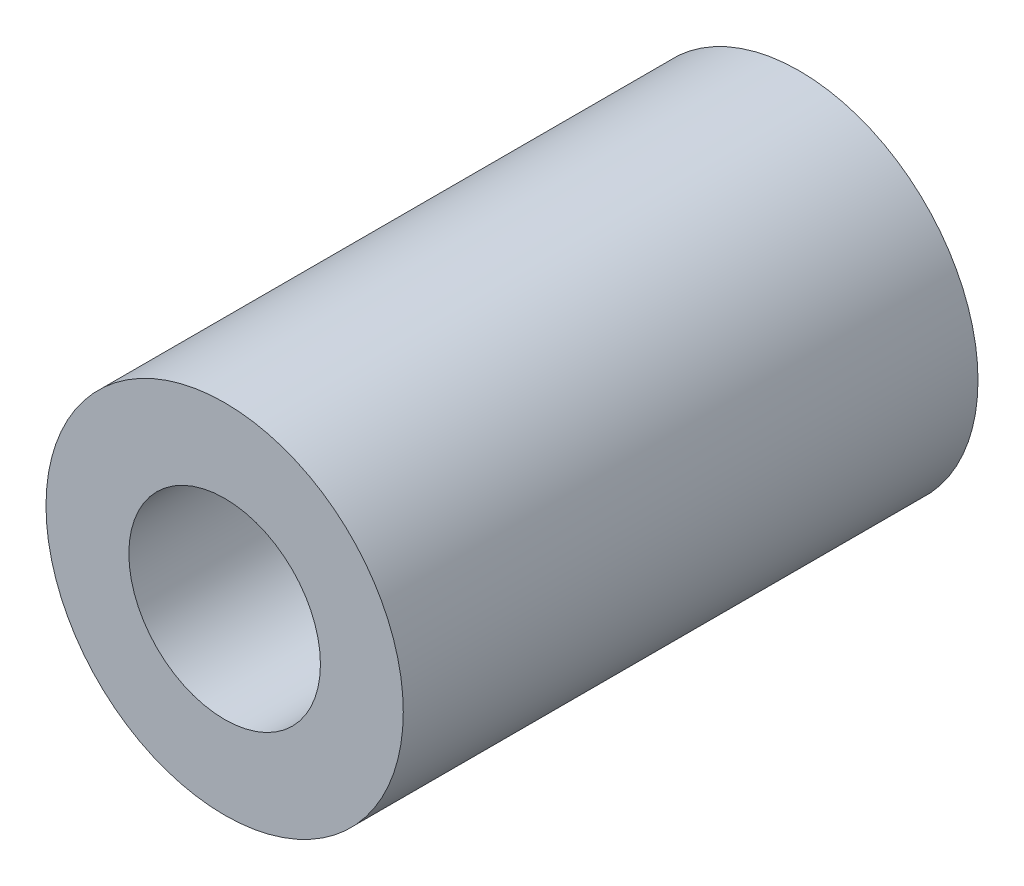
ISO-10303-21;
HEADER;
FILE_DESCRIPTION(('STEP AP214'),'2;1');
FILE_NAME('part.step','',(''),(''),'','','');
FILE_SCHEMA(('AUTOMOTIVE_DESIGN { 1 0 10303 214 1 1 1 1 }'));
ENDSEC;
DATA;
#1=APPLICATION_CONTEXT('core data for automotive mechanical design processes');
#2=APPLICATION_PROTOCOL_DEFINITION('international standard','automotive_design',2000,#1);
#3=PRODUCT_CONTEXT('',#1,'mechanical');
#4=PRODUCT('Part','Part','',(#3));
#5=PRODUCT_RELATED_PRODUCT_CATEGORY('part','',(#4));
#6=PRODUCT_DEFINITION_FORMATION('','',#4);
#7=PRODUCT_DEFINITION_CONTEXT('part definition',#1,'design');
#8=PRODUCT_DEFINITION('design','',#6,#7);
#9=PRODUCT_DEFINITION_SHAPE('','',#8);
#10=(LENGTH_UNIT() NAMED_UNIT(*) SI_UNIT(.MILLI.,.METRE.));
#11=(NAMED_UNIT(*) PLANE_ANGLE_UNIT() SI_UNIT($,.RADIAN.));
#12=(NAMED_UNIT(*) SI_UNIT($,.STERADIAN.) SOLID_ANGLE_UNIT());
#13=UNCERTAINTY_MEASURE_WITH_UNIT(LENGTH_MEASURE(1.E-05),#10,'distance_accuracy_value','');
#14=(GEOMETRIC_REPRESENTATION_CONTEXT(3) GLOBAL_UNCERTAINTY_ASSIGNED_CONTEXT((#13)) GLOBAL_UNIT_ASSIGNED_CONTEXT((#10,
#11,#12)) REPRESENTATION_CONTEXT('',''));
#15=CARTESIAN_POINT('',(0.,0.,0.));
#16=DIRECTION('',(0.,0.,1.));
#17=DIRECTION('',(1.,0.,0.));
#18=AXIS2_PLACEMENT_3D('',#15,#16,#17);
#19=CARTESIAN_POINT('',(0.,0.,24.));
#20=DIRECTION('',(0.,0.,-1.));
#21=DIRECTION('',(-1.,0.,0.));
#22=AXIS2_PLACEMENT_3D('',#19,#20,#21);
#23=CYLINDRICAL_SURFACE('',#22,7.46);
#24=CARTESIAN_POINT('',(0.,0.,24.));
#25=DIRECTION('',(0.,0.,1.));
#26=DIRECTION('',(1.,0.,0.));
#27=AXIS2_PLACEMENT_3D('',#24,#25,#26);
#28=CIRCLE('',#27,7.46);
#29=CARTESIAN_POINT('',(7.46,0.,24.));
#30=VERTEX_POINT('',#29);
#31=EDGE_CURVE('E10',#30,#30,#28,.T.);
#32=ORIENTED_EDGE('',*,*,#31,.F.);
#33=EDGE_LOOP('',(#32));
#34=FACE_BOUND('',#33,.T.);
#35=CARTESIAN_POINT('',(0.,0.,0.));
#36=DIRECTION('',(0.,0.,1.));
#37=DIRECTION('',(1.,0.,0.));
#38=AXIS2_PLACEMENT_3D('',#35,#36,#37);
#39=CIRCLE('',#38,7.46);
#40=CARTESIAN_POINT('',(7.46,0.,0.));
#41=VERTEX_POINT('',#40);
#42=EDGE_CURVE('E40',#41,#41,#39,.T.);
#43=ORIENTED_EDGE('',*,*,#42,.T.);
#44=EDGE_LOOP('',(#43));
#45=FACE_BOUND('',#44,.T.);
#46=ADVANCED_FACE('F37',(#34,#45),#23,.T.);
#47=CARTESIAN_POINT('',(0.,0.,24.));
#48=DIRECTION('',(0.,0.,1.));
#49=DIRECTION('',(1.,0.,0.));
#50=AXIS2_PLACEMENT_3D('',#47,#48,#49);
#51=PLANE('',#50);
#52=CARTESIAN_POINT('',(0.,0.,24.));
#53=DIRECTION('',(0.,0.,1.));
#54=DIRECTION('',(1.,0.,0.));
#55=AXIS2_PLACEMENT_3D('',#52,#53,#54);
#56=CIRCLE('',#55,4.);
#57=CARTESIAN_POINT('',(4.,0.,24.));
#58=VERTEX_POINT('',#57);
#59=EDGE_CURVE('E49',#58,#58,#56,.T.);
#60=ORIENTED_EDGE('',*,*,#59,.F.);
#61=EDGE_LOOP('',(#60));
#62=FACE_BOUND('',#61,.T.);
#63=ORIENTED_EDGE('',*,*,#31,.T.);
#64=EDGE_LOOP('',(#63));
#65=FACE_BOUND('',#64,.T.);
#66=ADVANCED_FACE('F62',(#62,#65),#51,.T.);
#67=CARTESIAN_POINT('',(0.,0.,0.));
#68=DIRECTION('',(0.,0.,1.));
#69=DIRECTION('',(1.,0.,0.));
#70=AXIS2_PLACEMENT_3D('',#67,#68,#69);
#71=PLANE('',#70);
#72=CARTESIAN_POINT('',(0.,0.,0.));
#73=DIRECTION('',(0.,0.,1.));
#74=DIRECTION('',(1.,0.,0.));
#75=AXIS2_PLACEMENT_3D('',#72,#73,#74);
#76=CIRCLE('',#75,4.);
#77=CARTESIAN_POINT('',(4.,0.,0.));
#78=VERTEX_POINT('',#77);
#79=EDGE_CURVE('E51',#78,#78,#76,.T.);
#80=ORIENTED_EDGE('',*,*,#79,.T.);
#81=EDGE_LOOP('',(#80));
#82=FACE_BOUND('',#81,.T.);
#83=ORIENTED_EDGE('',*,*,#42,.F.);
#84=EDGE_LOOP('',(#83));
#85=FACE_BOUND('',#84,.T.);
#86=ADVANCED_FACE('F64',(#82,#85),#71,.F.);
#87=CARTESIAN_POINT('',(0.,0.,24.));
#88=DIRECTION('',(0.,0.,-1.));
#89=DIRECTION('',(-1.,0.,0.));
#90=AXIS2_PLACEMENT_3D('',#87,#88,#89);
#91=CYLINDRICAL_SURFACE('',#90,4.);
#92=ORIENTED_EDGE('',*,*,#59,.T.);
#93=EDGE_LOOP('',(#92));
#94=FACE_BOUND('',#93,.T.);
#95=ORIENTED_EDGE('',*,*,#79,.F.);
#96=EDGE_LOOP('',(#95));
#97=FACE_BOUND('',#96,.T.);
#98=ADVANCED_FACE('F59',(#94,#97),#91,.F.);
#99=CLOSED_SHELL('',(#46,#66,#86,#98));
#100=MANIFOLD_SOLID_BREP('B2',#99);
#101=ADVANCED_BREP_SHAPE_REPRESENTATION('',(#18,#100),#14);
#102=SHAPE_DEFINITION_REPRESENTATION(#9,#101);
ENDSEC;
END-ISO-10303-21;
